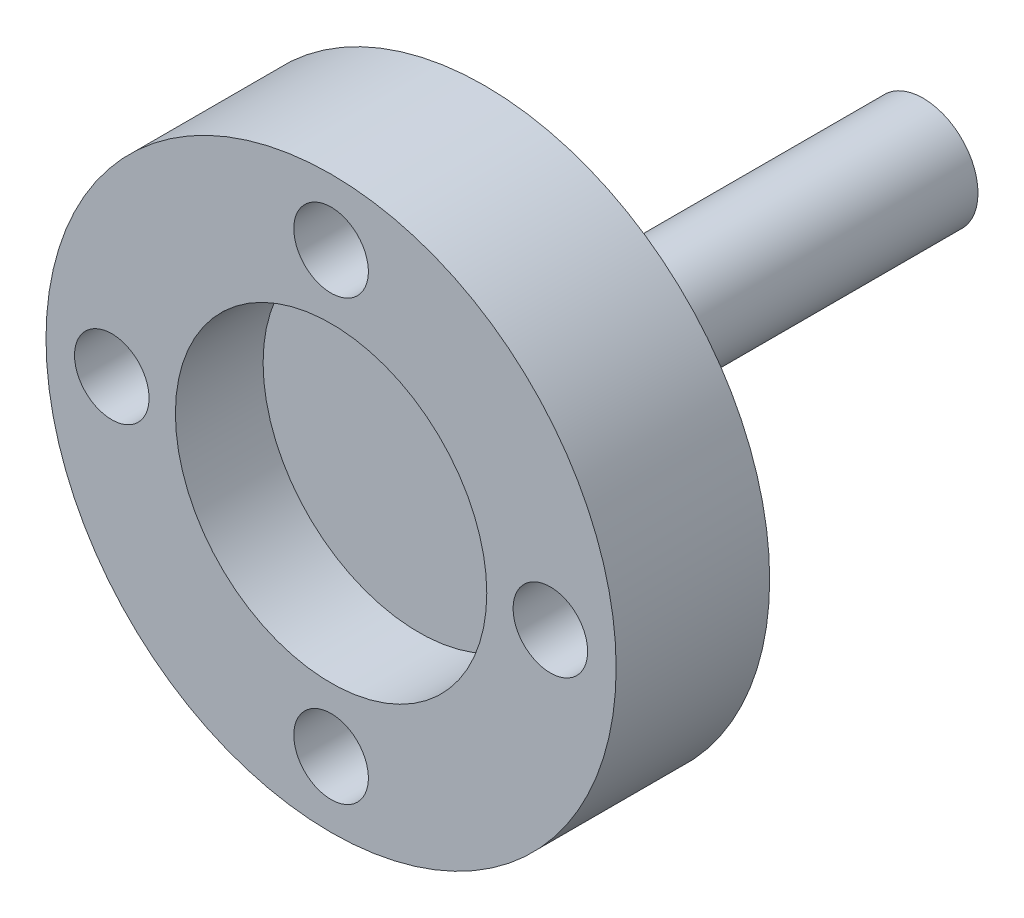
ISO-10303-21;
HEADER;
FILE_DESCRIPTION(('STEP AP214'),'2;1');
FILE_NAME('part.step','',(''),(''),'','','');
FILE_SCHEMA(('AUTOMOTIVE_DESIGN { 1 0 10303 214 1 1 1 1 }'));
ENDSEC;
DATA;
#1=APPLICATION_CONTEXT('core data for automotive mechanical design processes');
#2=APPLICATION_PROTOCOL_DEFINITION('international standard','automotive_design',2000,#1);
#3=PRODUCT_CONTEXT('',#1,'mechanical');
#4=PRODUCT('Part','Part','',(#3));
#5=PRODUCT_RELATED_PRODUCT_CATEGORY('part','',(#4));
#6=PRODUCT_DEFINITION_FORMATION('','',#4);
#7=PRODUCT_DEFINITION_CONTEXT('part definition',#1,'design');
#8=PRODUCT_DEFINITION('design','',#6,#7);
#9=PRODUCT_DEFINITION_SHAPE('','',#8);
#10=(LENGTH_UNIT() NAMED_UNIT(*) SI_UNIT(.MILLI.,.METRE.));
#11=(NAMED_UNIT(*) PLANE_ANGLE_UNIT() SI_UNIT($,.RADIAN.));
#12=(NAMED_UNIT(*) SI_UNIT($,.STERADIAN.) SOLID_ANGLE_UNIT());
#13=UNCERTAINTY_MEASURE_WITH_UNIT(LENGTH_MEASURE(1.E-05),#10,'distance_accuracy_value','');
#14=(GEOMETRIC_REPRESENTATION_CONTEXT(3) GLOBAL_UNCERTAINTY_ASSIGNED_CONTEXT((#13)) GLOBAL_UNIT_ASSIGNED_CONTEXT((#10,
#11,#12)) REPRESENTATION_CONTEXT('',''));
#15=CARTESIAN_POINT('',(0.,0.,0.));
#16=DIRECTION('',(0.,0.,1.));
#17=DIRECTION('',(1.,0.,0.));
#18=AXIS2_PLACEMENT_3D('',#15,#16,#17);
#19=CARTESIAN_POINT('',(0.,0.,0.));
#20=DIRECTION('',(0.,0.,1.));
#21=DIRECTION('',(1.,0.,0.));
#22=AXIS2_PLACEMENT_3D('',#19,#20,#21);
#23=PLANE('',#22);
#24=CARTESIAN_POINT('',(0.,10.,0.));
#25=DIRECTION('',(0.,0.,-1.));
#26=DIRECTION('',(-1.,0.,0.));
#27=AXIS2_PLACEMENT_3D('',#24,#25,#26);
#28=CIRCLE('',#27,1.69999999999999);
#29=CARTESIAN_POINT('',(-1.69999999999999,10.,0.));
#30=VERTEX_POINT('',#29);
#31=EDGE_CURVE('E91',#30,#30,#28,.T.);
#32=ORIENTED_EDGE('',*,*,#31,.F.);
#33=EDGE_LOOP('',(#32));
#34=FACE_BOUND('',#33,.T.);
#35=CARTESIAN_POINT('',(10.,0.,0.));
#36=DIRECTION('',(0.,0.,-1.));
#37=DIRECTION('',(-1.,0.,0.));
#38=AXIS2_PLACEMENT_3D('',#35,#36,#37);
#39=CIRCLE('',#38,1.69999999999999);
#40=CARTESIAN_POINT('',(8.30000000000001,0.,0.));
#41=VERTEX_POINT('',#40);
#42=EDGE_CURVE('E85',#41,#41,#39,.T.);
#43=ORIENTED_EDGE('',*,*,#42,.F.);
#44=EDGE_LOOP('',(#43));
#45=FACE_BOUND('',#44,.T.);
#46=CARTESIAN_POINT('',(0.,-10.,0.));
#47=DIRECTION('',(0.,0.,-1.));
#48=DIRECTION('',(-1.,0.,0.));
#49=AXIS2_PLACEMENT_3D('',#46,#47,#48);
#50=CIRCLE('',#49,1.69999999999999);
#51=CARTESIAN_POINT('',(-1.69999999999999,-10.,0.));
#52=VERTEX_POINT('',#51);
#53=EDGE_CURVE('E79',#52,#52,#50,.T.);
#54=ORIENTED_EDGE('',*,*,#53,.F.);
#55=EDGE_LOOP('',(#54));
#56=FACE_BOUND('',#55,.T.);
#57=CARTESIAN_POINT('',(-10.,0.,0.));
#58=DIRECTION('',(0.,0.,-1.));
#59=DIRECTION('',(-1.,0.,0.));
#60=AXIS2_PLACEMENT_3D('',#57,#58,#59);
#61=CIRCLE('',#60,1.69999999999999);
#62=CARTESIAN_POINT('',(-11.7,0.,0.));
#63=VERTEX_POINT('',#62);
#64=EDGE_CURVE('E73',#63,#63,#61,.T.);
#65=ORIENTED_EDGE('',*,*,#64,.F.);
#66=EDGE_LOOP('',(#65));
#67=FACE_BOUND('',#66,.T.);
#68=CARTESIAN_POINT('',(0.,0.,0.));
#69=DIRECTION('',(0.,0.,1.));
#70=DIRECTION('',(1.,0.,0.));
#71=AXIS2_PLACEMENT_3D('',#68,#69,#70);
#72=CIRCLE('',#71,13.);
#73=CARTESIAN_POINT('',(13.,0.,0.));
#74=VERTEX_POINT('',#73);
#75=EDGE_CURVE('E55',#74,#74,#72,.T.);
#76=ORIENTED_EDGE('',*,*,#75,.F.);
#77=EDGE_LOOP('',(#76));
#78=FACE_BOUND('',#77,.T.);
#79=CARTESIAN_POINT('',(0.,0.,0.));
#80=DIRECTION('',(0.,0.,1.));
#81=DIRECTION('',(1.,0.,0.));
#82=AXIS2_PLACEMENT_3D('',#79,#80,#81);
#83=CIRCLE('',#82,2.5);
#84=CARTESIAN_POINT('',(2.5,0.,0.));
#85=VERTEX_POINT('',#84);
#86=EDGE_CURVE('E12',#85,#85,#83,.F.);
#87=ORIENTED_EDGE('',*,*,#86,.F.);
#88=EDGE_LOOP('',(#87));
#89=FACE_BOUND('',#88,.T.);
#90=ADVANCED_FACE('F44',(#34,#45,#56,#67,#78,#89),#23,.F.);
#91=CARTESIAN_POINT('',(0.,0.,7.));
#92=DIRECTION('',(0.,0.,-1.));
#93=DIRECTION('',(-1.,0.,0.));
#94=AXIS2_PLACEMENT_3D('',#91,#92,#93);
#95=CYLINDRICAL_SURFACE('',#94,13.);
#96=CARTESIAN_POINT('',(0.,0.,7.));
#97=DIRECTION('',(0.,0.,1.));
#98=DIRECTION('',(1.,0.,0.));
#99=AXIS2_PLACEMENT_3D('',#96,#97,#98);
#100=CIRCLE('',#99,13.);
#101=CARTESIAN_POINT('',(13.,0.,7.));
#102=VERTEX_POINT('',#101);
#103=EDGE_CURVE('E51',#102,#102,#100,.T.);
#104=ORIENTED_EDGE('',*,*,#103,.F.);
#105=EDGE_LOOP('',(#104));
#106=FACE_BOUND('',#105,.T.);
#107=ORIENTED_EDGE('',*,*,#75,.T.);
#108=EDGE_LOOP('',(#107));
#109=FACE_BOUND('',#108,.T.);
#110=ADVANCED_FACE('F46',(#106,#109),#95,.T.);
#111=CARTESIAN_POINT('',(0.,0.,7.));
#112=DIRECTION('',(0.,0.,1.));
#113=DIRECTION('',(1.,0.,0.));
#114=AXIS2_PLACEMENT_3D('',#111,#112,#113);
#115=PLANE('',#114);
#116=CARTESIAN_POINT('',(0.,10.,7.));
#117=DIRECTION('',(0.,0.,-1.));
#118=DIRECTION('',(-1.,0.,0.));
#119=AXIS2_PLACEMENT_3D('',#116,#117,#118);
#120=CIRCLE('',#119,1.7);
#121=CARTESIAN_POINT('',(-1.7,10.,7.));
#122=VERTEX_POINT('',#121);
#123=EDGE_CURVE('E88',#122,#122,#120,.T.);
#124=ORIENTED_EDGE('',*,*,#123,.T.);
#125=EDGE_LOOP('',(#124));
#126=FACE_BOUND('',#125,.T.);
#127=CARTESIAN_POINT('',(10.,0.,7.));
#128=DIRECTION('',(0.,0.,-1.));
#129=DIRECTION('',(-1.,0.,0.));
#130=AXIS2_PLACEMENT_3D('',#127,#128,#129);
#131=CIRCLE('',#130,1.7);
#132=CARTESIAN_POINT('',(8.3,0.,7.));
#133=VERTEX_POINT('',#132);
#134=EDGE_CURVE('E82',#133,#133,#131,.T.);
#135=ORIENTED_EDGE('',*,*,#134,.T.);
#136=EDGE_LOOP('',(#135));
#137=FACE_BOUND('',#136,.T.);
#138=CARTESIAN_POINT('',(0.,-10.,7.));
#139=DIRECTION('',(0.,0.,-1.));
#140=DIRECTION('',(-1.,0.,0.));
#141=AXIS2_PLACEMENT_3D('',#138,#139,#140);
#142=CIRCLE('',#141,1.7);
#143=CARTESIAN_POINT('',(-1.7,-10.,7.));
#144=VERTEX_POINT('',#143);
#145=EDGE_CURVE('E76',#144,#144,#142,.T.);
#146=ORIENTED_EDGE('',*,*,#145,.T.);
#147=EDGE_LOOP('',(#146));
#148=FACE_BOUND('',#147,.T.);
#149=CARTESIAN_POINT('',(-10.,0.,7.));
#150=DIRECTION('',(0.,0.,-1.));
#151=DIRECTION('',(-1.,0.,0.));
#152=AXIS2_PLACEMENT_3D('',#149,#150,#151);
#153=CIRCLE('',#152,1.7);
#154=CARTESIAN_POINT('',(-11.7,0.,7.));
#155=VERTEX_POINT('',#154);
#156=EDGE_CURVE('E70',#155,#155,#153,.T.);
#157=ORIENTED_EDGE('',*,*,#156,.T.);
#158=EDGE_LOOP('',(#157));
#159=FACE_BOUND('',#158,.T.);
#160=CARTESIAN_POINT('',(0.,0.,7.));
#161=DIRECTION('',(0.,0.,1.));
#162=DIRECTION('',(1.,0.,0.));
#163=AXIS2_PLACEMENT_3D('',#160,#161,#162);
#164=CIRCLE('',#163,7.1);
#165=CARTESIAN_POINT('',(7.1,0.,7.));
#166=VERTEX_POINT('',#165);
#167=EDGE_CURVE('E62',#166,#166,#164,.T.);
#168=ORIENTED_EDGE('',*,*,#167,.F.);
#169=EDGE_LOOP('',(#168));
#170=FACE_BOUND('',#169,.T.);
#171=ORIENTED_EDGE('',*,*,#103,.T.);
#172=EDGE_LOOP('',(#171));
#173=FACE_BOUND('',#172,.T.);
#174=ADVANCED_FACE('F109',(#126,#137,#148,#159,#170,#173),#115,.T.);
#175=CARTESIAN_POINT('',(0.,0.,3.));
#176=DIRECTION('',(0.,0.,1.));
#177=DIRECTION('',(1.,0.,0.));
#178=AXIS2_PLACEMENT_3D('',#175,#176,#177);
#179=CYLINDRICAL_SURFACE('',#178,7.1);
#180=CARTESIAN_POINT('',(0.,0.,3.));
#181=DIRECTION('',(0.,0.,1.));
#182=DIRECTION('',(1.,0.,0.));
#183=AXIS2_PLACEMENT_3D('',#180,#181,#182);
#184=CIRCLE('',#183,7.1);
#185=CARTESIAN_POINT('',(7.1,0.,3.));
#186=VERTEX_POINT('',#185);
#187=EDGE_CURVE('E60',#186,#186,#184,.T.);
#188=ORIENTED_EDGE('',*,*,#187,.F.);
#189=EDGE_LOOP('',(#188));
#190=FACE_BOUND('',#189,.T.);
#191=ORIENTED_EDGE('',*,*,#167,.T.);
#192=EDGE_LOOP('',(#191));
#193=FACE_BOUND('',#192,.T.);
#194=ADVANCED_FACE('F114',(#190,#193),#179,.F.);
#195=CARTESIAN_POINT('',(0.,0.,3.));
#196=DIRECTION('',(0.,0.,1.));
#197=DIRECTION('',(1.,0.,0.));
#198=AXIS2_PLACEMENT_3D('',#195,#196,#197);
#199=PLANE('',#198);
#200=ORIENTED_EDGE('',*,*,#187,.T.);
#201=EDGE_LOOP('',(#200));
#202=FACE_BOUND('',#201,.T.);
#203=ADVANCED_FACE('F120',(#202),#199,.T.);
#204=CARTESIAN_POINT('',(0.,0.,-20.));
#205=DIRECTION('',(0.,0.,1.));
#206=DIRECTION('',(1.,0.,0.));
#207=AXIS2_PLACEMENT_3D('',#204,#205,#206);
#208=CYLINDRICAL_SURFACE('',#207,2.5);
#209=CARTESIAN_POINT('',(0.,0.,-20.));
#210=DIRECTION('',(0.,0.,-1.));
#211=DIRECTION('',(-1.,0.,0.));
#212=AXIS2_PLACEMENT_3D('',#209,#210,#211);
#213=CIRCLE('',#212,2.5);
#214=CARTESIAN_POINT('',(-2.5,0.,-20.));
#215=VERTEX_POINT('',#214);
#216=EDGE_CURVE('E65',#215,#215,#213,.T.);
#217=ORIENTED_EDGE('',*,*,#216,.F.);
#218=EDGE_LOOP('',(#217));
#219=FACE_BOUND('',#218,.T.);
#220=ORIENTED_EDGE('',*,*,#86,.T.);
#221=EDGE_LOOP('',(#220));
#222=FACE_BOUND('',#221,.T.);
#223=ADVANCED_FACE('F127',(#219,#222),#208,.T.);
#224=CARTESIAN_POINT('',(0.,0.,-20.));
#225=DIRECTION('',(0.,0.,-1.));
#226=DIRECTION('',(-1.,0.,0.));
#227=AXIS2_PLACEMENT_3D('',#224,#225,#226);
#228=PLANE('',#227);
#229=ORIENTED_EDGE('',*,*,#216,.T.);
#230=EDGE_LOOP('',(#229));
#231=FACE_BOUND('',#230,.T.);
#232=ADVANCED_FACE('F131',(#231),#228,.T.);
#233=CARTESIAN_POINT('',(-10.,0.,0.));
#234=DIRECTION('',(0.,0.,-1.));
#235=DIRECTION('',(-1.,0.,0.));
#236=AXIS2_PLACEMENT_3D('',#233,#234,#235);
#237=CYLINDRICAL_SURFACE('',#236,1.69999999999999);
#238=ORIENTED_EDGE('',*,*,#156,.F.);
#239=EDGE_LOOP('',(#238));
#240=FACE_BOUND('',#239,.T.);
#241=ORIENTED_EDGE('',*,*,#64,.T.);
#242=EDGE_LOOP('',(#241));
#243=FACE_BOUND('',#242,.T.);
#244=ADVANCED_FACE('F135',(#240,#243),#237,.F.);
#245=CARTESIAN_POINT('',(0.,-10.,0.));
#246=DIRECTION('',(0.,0.,-1.));
#247=DIRECTION('',(-1.,0.,0.));
#248=AXIS2_PLACEMENT_3D('',#245,#246,#247);
#249=CYLINDRICAL_SURFACE('',#248,1.69999999999999);
#250=ORIENTED_EDGE('',*,*,#145,.F.);
#251=EDGE_LOOP('',(#250));
#252=FACE_BOUND('',#251,.T.);
#253=ORIENTED_EDGE('',*,*,#53,.T.);
#254=EDGE_LOOP('',(#253));
#255=FACE_BOUND('',#254,.T.);
#256=ADVANCED_FACE('F139',(#252,#255),#249,.F.);
#257=CARTESIAN_POINT('',(10.,0.,0.));
#258=DIRECTION('',(0.,0.,-1.));
#259=DIRECTION('',(-1.,0.,0.));
#260=AXIS2_PLACEMENT_3D('',#257,#258,#259);
#261=CYLINDRICAL_SURFACE('',#260,1.69999999999999);
#262=ORIENTED_EDGE('',*,*,#134,.F.);
#263=EDGE_LOOP('',(#262));
#264=FACE_BOUND('',#263,.T.);
#265=ORIENTED_EDGE('',*,*,#42,.T.);
#266=EDGE_LOOP('',(#265));
#267=FACE_BOUND('',#266,.T.);
#268=ADVANCED_FACE('F143',(#264,#267),#261,.F.);
#269=CARTESIAN_POINT('',(0.,10.,0.));
#270=DIRECTION('',(0.,0.,-1.));
#271=DIRECTION('',(-1.,0.,0.));
#272=AXIS2_PLACEMENT_3D('',#269,#270,#271);
#273=CYLINDRICAL_SURFACE('',#272,1.69999999999999);
#274=ORIENTED_EDGE('',*,*,#123,.F.);
#275=EDGE_LOOP('',(#274));
#276=FACE_BOUND('',#275,.T.);
#277=ORIENTED_EDGE('',*,*,#31,.T.);
#278=EDGE_LOOP('',(#277));
#279=FACE_BOUND('',#278,.T.);
#280=ADVANCED_FACE('F95',(#276,#279),#273,.F.);
#281=CLOSED_SHELL('',(#90,#110,#174,#194,#203,#223,#232,#244,#256,#268,#280));
#282=MANIFOLD_SOLID_BREP('B2',#281);
#283=ADVANCED_BREP_SHAPE_REPRESENTATION('',(#18,#282),#14);
#284=SHAPE_DEFINITION_REPRESENTATION(#9,#283);
ENDSEC;
END-ISO-10303-21;
